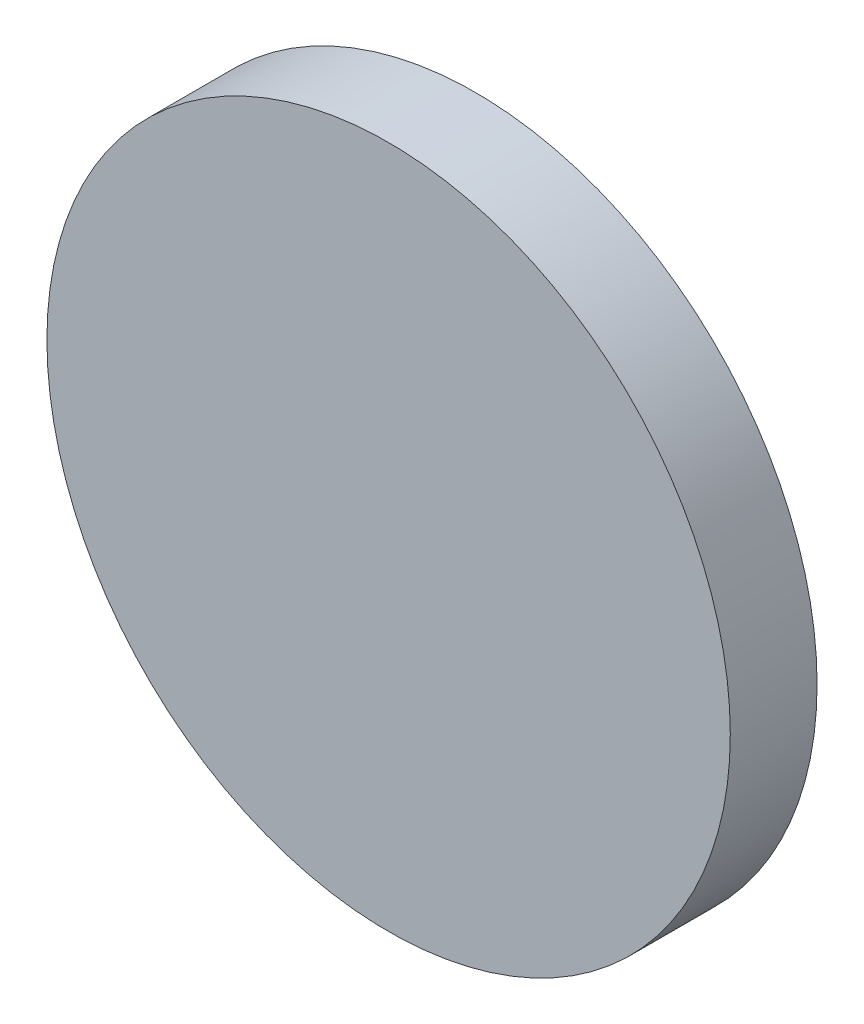
ISO-10303-21;
HEADER;
FILE_DESCRIPTION(('STEP AP214'),'2;1');
FILE_NAME('part.step','',(''),(''),'','','');
FILE_SCHEMA(('AUTOMOTIVE_DESIGN { 1 0 10303 214 1 1 1 1 }'));
ENDSEC;
DATA;
#1=APPLICATION_CONTEXT('core data for automotive mechanical design processes');
#2=APPLICATION_PROTOCOL_DEFINITION('international standard','automotive_design',2000,#1);
#3=PRODUCT_CONTEXT('',#1,'mechanical');
#4=PRODUCT('Part','Part','',(#3));
#5=PRODUCT_RELATED_PRODUCT_CATEGORY('part','',(#4));
#6=PRODUCT_DEFINITION_FORMATION('','',#4);
#7=PRODUCT_DEFINITION_CONTEXT('part definition',#1,'design');
#8=PRODUCT_DEFINITION('design','',#6,#7);
#9=PRODUCT_DEFINITION_SHAPE('','',#8);
#10=(LENGTH_UNIT() NAMED_UNIT(*) SI_UNIT(.MILLI.,.METRE.));
#11=(NAMED_UNIT(*) PLANE_ANGLE_UNIT() SI_UNIT($,.RADIAN.));
#12=(NAMED_UNIT(*) SI_UNIT($,.STERADIAN.) SOLID_ANGLE_UNIT());
#13=UNCERTAINTY_MEASURE_WITH_UNIT(LENGTH_MEASURE(1.E-05),#10,'distance_accuracy_value','');
#14=(GEOMETRIC_REPRESENTATION_CONTEXT(3) GLOBAL_UNCERTAINTY_ASSIGNED_CONTEXT((#13)) GLOBAL_UNIT_ASSIGNED_CONTEXT((#10,
#11,#12)) REPRESENTATION_CONTEXT('',''));
#15=CARTESIAN_POINT('',(0.,0.,0.));
#16=DIRECTION('',(0.,0.,1.));
#17=DIRECTION('',(1.,0.,0.));
#18=AXIS2_PLACEMENT_3D('',#15,#16,#17);
#19=CARTESIAN_POINT('',(0.,0.,6.35));
#20=DIRECTION('',(0.,0.,-1.));
#21=DIRECTION('',(-1.,0.,0.));
#22=AXIS2_PLACEMENT_3D('',#19,#20,#21);
#23=CYLINDRICAL_SURFACE('',#22,25.);
#24=CARTESIAN_POINT('',(0.,0.,6.35));
#25=DIRECTION('',(0.,0.,1.));
#26=DIRECTION('',(1.,0.,0.));
#27=AXIS2_PLACEMENT_3D('',#24,#25,#26);
#28=CIRCLE('',#27,25.);
#29=CARTESIAN_POINT('',(25.,0.,6.35));
#30=VERTEX_POINT('',#29);
#31=EDGE_CURVE('E10',#30,#30,#28,.T.);
#32=ORIENTED_EDGE('',*,*,#31,.F.);
#33=EDGE_LOOP('',(#32));
#34=FACE_BOUND('',#33,.T.);
#35=CARTESIAN_POINT('',(0.,0.,0.));
#36=DIRECTION('',(0.,0.,1.));
#37=DIRECTION('',(1.,0.,0.));
#38=AXIS2_PLACEMENT_3D('',#35,#36,#37);
#39=CIRCLE('',#38,25.);
#40=CARTESIAN_POINT('',(25.,0.,0.));
#41=VERTEX_POINT('',#40);
#42=EDGE_CURVE('E34',#41,#41,#39,.T.);
#43=ORIENTED_EDGE('',*,*,#42,.T.);
#44=EDGE_LOOP('',(#43));
#45=FACE_BOUND('',#44,.T.);
#46=ADVANCED_FACE('F31',(#34,#45),#23,.T.);
#47=CARTESIAN_POINT('',(0.,0.,6.35));
#48=DIRECTION('',(0.,0.,1.));
#49=DIRECTION('',(1.,0.,0.));
#50=AXIS2_PLACEMENT_3D('',#47,#48,#49);
#51=PLANE('',#50);
#52=ORIENTED_EDGE('',*,*,#31,.T.);
#53=EDGE_LOOP('',(#52));
#54=FACE_BOUND('',#53,.T.);
#55=ADVANCED_FACE('F46',(#54),#51,.T.);
#56=CARTESIAN_POINT('',(0.,0.,0.));
#57=DIRECTION('',(0.,0.,1.));
#58=DIRECTION('',(1.,0.,0.));
#59=AXIS2_PLACEMENT_3D('',#56,#57,#58);
#60=PLANE('',#59);
#61=ORIENTED_EDGE('',*,*,#42,.F.);
#62=EDGE_LOOP('',(#61));
#63=FACE_BOUND('',#62,.T.);
#64=ADVANCED_FACE('F44',(#63),#60,.F.);
#65=CLOSED_SHELL('',(#46,#55,#64));
#66=MANIFOLD_SOLID_BREP('B2',#65);
#67=ADVANCED_BREP_SHAPE_REPRESENTATION('',(#18,#66),#14);
#68=SHAPE_DEFINITION_REPRESENTATION(#9,#67);
ENDSEC;
END-ISO-10303-21;
